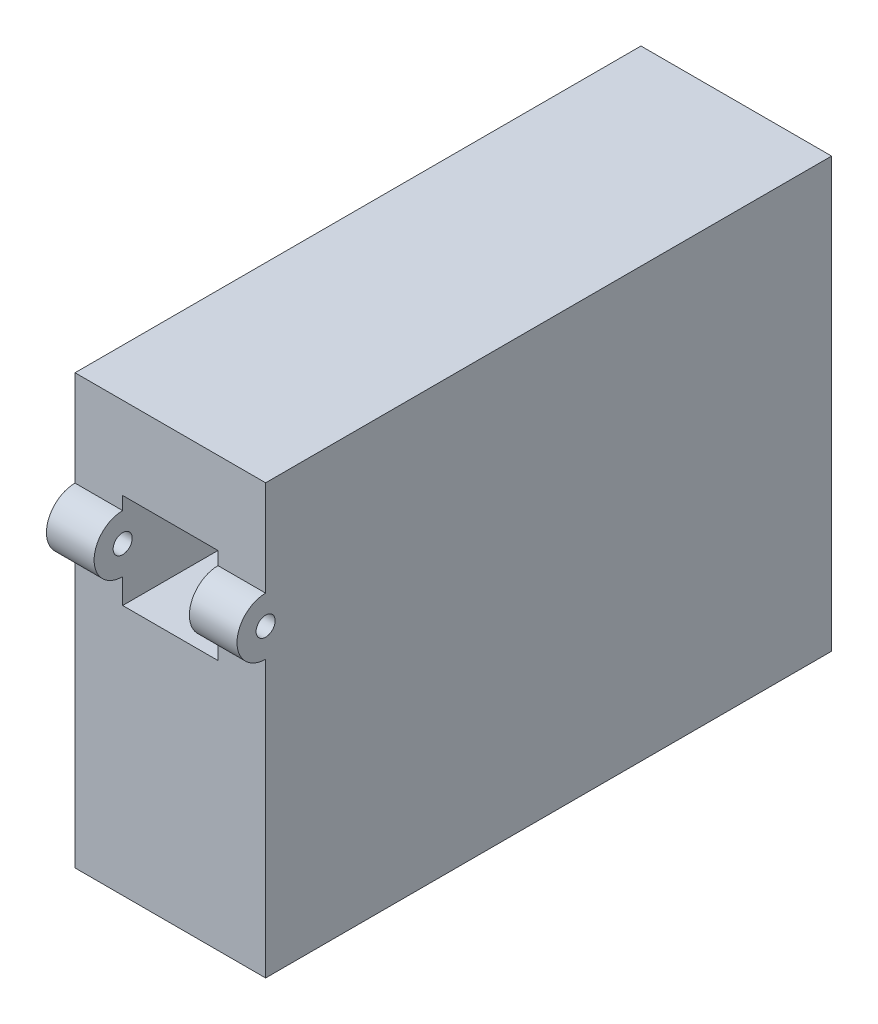
ISO-10303-21;
HEADER;
FILE_DESCRIPTION(('STEP AP214'),'2;1');
FILE_NAME('part.step','',(''),(''),'','','');
FILE_SCHEMA(('AUTOMOTIVE_DESIGN { 1 0 10303 214 1 1 1 1 }'));
ENDSEC;
DATA;
#1=APPLICATION_CONTEXT('core data for automotive mechanical design processes');
#2=APPLICATION_PROTOCOL_DEFINITION('international standard','automotive_design',2000,#1);
#3=PRODUCT_CONTEXT('',#1,'mechanical');
#4=PRODUCT('Part','Part','',(#3));
#5=PRODUCT_RELATED_PRODUCT_CATEGORY('part','',(#4));
#6=PRODUCT_DEFINITION_FORMATION('','',#4);
#7=PRODUCT_DEFINITION_CONTEXT('part definition',#1,'design');
#8=PRODUCT_DEFINITION('design','',#6,#7);
#9=PRODUCT_DEFINITION_SHAPE('','',#8);
#10=(LENGTH_UNIT() NAMED_UNIT(*) SI_UNIT(.MILLI.,.METRE.));
#11=(NAMED_UNIT(*) PLANE_ANGLE_UNIT() SI_UNIT($,.RADIAN.));
#12=(NAMED_UNIT(*) SI_UNIT($,.STERADIAN.) SOLID_ANGLE_UNIT());
#13=UNCERTAINTY_MEASURE_WITH_UNIT(LENGTH_MEASURE(1.E-05),#10,'distance_accuracy_value','');
#14=(GEOMETRIC_REPRESENTATION_CONTEXT(3) GLOBAL_UNCERTAINTY_ASSIGNED_CONTEXT((#13)) GLOBAL_UNIT_ASSIGNED_CONTEXT((#10,
#11,#12)) REPRESENTATION_CONTEXT('',''));
#15=CARTESIAN_POINT('',(0.,0.,0.));
#16=DIRECTION('',(0.,0.,1.));
#17=DIRECTION('',(1.,0.,0.));
#18=AXIS2_PLACEMENT_3D('',#15,#16,#17);
#19=CARTESIAN_POINT('',(-39.738281037695,36.9720169389535,5.37256734597199));
#20=DIRECTION('',(1.,0.,0.));
#21=DIRECTION('',(0.,0.,-1.));
#22=AXIS2_PLACEMENT_3D('',#19,#20,#21);
#23=CYLINDRICAL_SURFACE('',#22,1.);
#24=CARTESIAN_POINT('',(-54.7382810376951,36.9720169389535,5.37256734597198));
#25=DIRECTION('',(1.,0.,0.));
#26=DIRECTION('',(0.,0.,1.));
#27=AXIS2_PLACEMENT_3D('',#24,#25,#26);
#28=CIRCLE('',#27,1.);
#29=CARTESIAN_POINT('',(-54.7382810376951,36.9720169389535,6.37256734597198));
#30=VERTEX_POINT('',#29);
#31=EDGE_CURVE('E293',#30,#30,#28,.T.);
#32=ORIENTED_EDGE('',*,*,#31,.F.);
#33=EDGE_LOOP('',(#32));
#34=FACE_BOUND('',#33,.T.);
#35=CARTESIAN_POINT('',(-49.7382810376951,36.9720169389535,5.37256734597198));
#36=DIRECTION('',(1.,0.,0.));
#37=DIRECTION('',(0.,0.,1.));
#38=AXIS2_PLACEMENT_3D('',#35,#36,#37);
#39=CIRCLE('',#38,1.);
#40=CARTESIAN_POINT('',(-49.7382810376951,36.9720169389535,6.37256734597198));
#41=VERTEX_POINT('',#40);
#42=EDGE_CURVE('E296',#41,#41,#39,.T.);
#43=ORIENTED_EDGE('',*,*,#42,.T.);
#44=EDGE_LOOP('',(#43));
#45=FACE_BOUND('',#44,.T.);
#46=ADVANCED_FACE('F34',(#34,#45),#23,.F.);
#47=CARTESIAN_POINT('',(-39.7382810376951,36.9720169389535,5.37256734597198));
#48=DIRECTION('',(1.,0.,0.));
#49=DIRECTION('',(0.,0.,-1.));
#50=AXIS2_PLACEMENT_3D('',#47,#48,#49);
#51=CIRCLE('',#50,1.);
#52=CARTESIAN_POINT('',(-39.7382810376951,36.9720169389535,4.37256734597198));
#53=VERTEX_POINT('',#52);
#54=EDGE_CURVE('E306',#53,#53,#51,.T.);
#55=ORIENTED_EDGE('',*,*,#54,.F.);
#56=EDGE_LOOP('',(#55));
#57=FACE_BOUND('',#56,.T.);
#58=CARTESIAN_POINT('',(-34.7382810376951,36.9720169389535,5.37256734597198));
#59=DIRECTION('',(1.,0.,0.));
#60=DIRECTION('',(0.,0.,-1.));
#61=AXIS2_PLACEMENT_3D('',#58,#59,#60);
#62=CIRCLE('',#61,1.);
#63=CARTESIAN_POINT('',(-34.7382810376951,36.9720169389535,4.37256734597198));
#64=VERTEX_POINT('',#63);
#65=EDGE_CURVE('E308',#64,#64,#62,.T.);
#66=ORIENTED_EDGE('',*,*,#65,.T.);
#67=EDGE_LOOP('',(#66));
#68=FACE_BOUND('',#67,.T.);
#69=ADVANCED_FACE('F252',(#57,#68),#23,.F.);
#70=CARTESIAN_POINT('',(-34.7382810376951,-9.99999857891453E-05,5.37256734597198));
#71=DIRECTION('',(0.,0.,1.));
#72=DIRECTION('',(1.,0.,0.));
#73=AXIS2_PLACEMENT_3D('',#70,#71,#72);
#74=PLANE('',#73);
#75=DIRECTION('',(-1.,0.,0.));
#76=VECTOR('',#75,1.);
#77=CARTESIAN_POINT('',(-49.7382810376951,39.9720169389535,5.37256734597198));
#78=LINE('',#77,#76);
#79=CARTESIAN_POINT('',(-49.7382810376951,39.9720169389535,5.37256734597198));
#80=VERTEX_POINT('',#79);
#81=CARTESIAN_POINT('',(-54.7382810376951,39.9720169389535,5.37256734597198));
#82=VERTEX_POINT('',#81);
#83=EDGE_CURVE('E314',#80,#82,#78,.T.);
#84=ORIENTED_EDGE('',*,*,#83,.F.);
#85=DIRECTION('',(0.,-1.,0.));
#86=VECTOR('',#85,1.);
#87=CARTESIAN_POINT('',(-49.7382810376951,31.3488225347687,5.37256734597198));
#88=LINE('',#87,#86);
#89=CARTESIAN_POINT('',(-49.7382810376951,41.3488225347687,5.37256734597198));
#90=VERTEX_POINT('',#89);
#91=EDGE_CURVE('E281',#90,#80,#88,.T.);
#92=ORIENTED_EDGE('',*,*,#91,.F.);
#93=DIRECTION('',(-1.,0.,0.));
#94=VECTOR('',#93,1.);
#95=CARTESIAN_POINT('',(-49.7382810376951,41.3488225347687,5.37256734597198));
#96=LINE('',#95,#94);
#97=CARTESIAN_POINT('',(-39.7382810376951,41.3488225347687,5.37256734597198));
#98=VERTEX_POINT('',#97);
#99=EDGE_CURVE('E219',#98,#90,#96,.T.);
#100=ORIENTED_EDGE('',*,*,#99,.F.);
#101=DIRECTION('',(0.,1.,0.));
#102=VECTOR('',#101,1.);
#103=CARTESIAN_POINT('',(-39.7382810376951,41.3488225347687,5.37256734597198));
#104=LINE('',#103,#102);
#105=CARTESIAN_POINT('',(-39.7382810376951,39.9720169389535,5.37256734597199));
#106=VERTEX_POINT('',#105);
#107=EDGE_CURVE('E210',#106,#98,#104,.T.);
#108=ORIENTED_EDGE('',*,*,#107,.F.);
#109=DIRECTION('',(1.,0.,0.));
#110=VECTOR('',#109,1.);
#111=CARTESIAN_POINT('',(-39.7382810376951,39.9720169389535,5.37256734597199));
#112=LINE('',#111,#110);
#113=CARTESIAN_POINT('',(-34.7382810376951,39.9720169389535,5.37256734597199));
#114=VERTEX_POINT('',#113);
#115=EDGE_CURVE('E297',#106,#114,#112,.T.);
#116=ORIENTED_EDGE('',*,*,#115,.T.);
#117=DIRECTION('',(0.,1.,0.));
#118=VECTOR('',#117,1.);
#119=CARTESIAN_POINT('',(-34.7382810376951,-9.99999857891453E-05,5.37256734597198));
#120=LINE('',#119,#118);
#121=CARTESIAN_POINT('',(-34.7382810376951,50.0000000000142,5.37256734597198));
#122=VERTEX_POINT('',#121);
#123=EDGE_CURVE('E185',#114,#122,#120,.T.);
#124=ORIENTED_EDGE('',*,*,#123,.T.);
#125=DIRECTION('',(1.,0.,0.));
#126=VECTOR('',#125,1.);
#127=CARTESIAN_POINT('',(-34.7382810376951,50.0000000000142,5.37256734597198));
#128=LINE('',#127,#126);
#129=CARTESIAN_POINT('',(-54.7382810376951,50.0000000000142,5.37256734597198));
#130=VERTEX_POINT('',#129);
#131=EDGE_CURVE('E221',#130,#122,#128,.T.);
#132=ORIENTED_EDGE('',*,*,#131,.F.);
#133=DIRECTION('',(0.,1.,0.));
#134=VECTOR('',#133,1.);
#135=CARTESIAN_POINT('',(-54.7382810376951,-9.99999857891453E-05,5.37256734597198));
#136=LINE('',#135,#134);
#137=EDGE_CURVE('E187',#82,#130,#136,.T.);
#138=ORIENTED_EDGE('',*,*,#137,.F.);
#139=EDGE_LOOP('',(#84,#92,#100,#108,#116,#124,#132,#138));
#140=FACE_BOUND('',#139,.T.);
#141=ADVANCED_FACE('F234',(#140),#74,.T.);
#142=DIRECTION('',(-1.,0.,0.));
#143=VECTOR('',#142,1.);
#144=CARTESIAN_POINT('',(-54.7382810376951,4.99990000001421,5.37256734597199));
#145=LINE('',#144,#143);
#146=CARTESIAN_POINT('',(-34.7382810376951,4.99990000001421,5.37256734597198));
#147=VERTEX_POINT('',#146);
#148=CARTESIAN_POINT('',(-54.7382810376951,4.99990000001421,5.37256734597199));
#149=VERTEX_POINT('',#148);
#150=EDGE_CURVE('E164',#147,#149,#145,.T.);
#151=ORIENTED_EDGE('',*,*,#150,.F.);
#152=CARTESIAN_POINT('',(-34.7382810376951,33.9720169389535,5.37256734597199));
#153=VERTEX_POINT('',#152);
#154=EDGE_CURVE('E178',#147,#153,#120,.T.);
#155=ORIENTED_EDGE('',*,*,#154,.T.);
#156=DIRECTION('',(1.,0.,0.));
#157=VECTOR('',#156,1.);
#158=CARTESIAN_POINT('',(-39.7382810376951,33.9720169389535,5.37256734597199));
#159=LINE('',#158,#157);
#160=CARTESIAN_POINT('',(-39.7382810376951,33.9720169389535,5.37256734597199));
#161=VERTEX_POINT('',#160);
#162=EDGE_CURVE('E287',#161,#153,#159,.T.);
#163=ORIENTED_EDGE('',*,*,#162,.F.);
#164=CARTESIAN_POINT('',(-39.7382810376951,31.3488225347687,5.37256734597198));
#165=VERTEX_POINT('',#164);
#166=EDGE_CURVE('E284',#165,#161,#104,.T.);
#167=ORIENTED_EDGE('',*,*,#166,.F.);
#168=DIRECTION('',(1.,0.,0.));
#169=VECTOR('',#168,1.);
#170=CARTESIAN_POINT('',(-39.7382810376951,31.3488225347687,5.37256734597198));
#171=LINE('',#170,#169);
#172=CARTESIAN_POINT('',(-49.7382810376951,31.3488225347687,5.37256734597198));
#173=VERTEX_POINT('',#172);
#174=EDGE_CURVE('E277',#173,#165,#171,.T.);
#175=ORIENTED_EDGE('',*,*,#174,.F.);
#176=CARTESIAN_POINT('',(-49.7382810376951,33.9720169389535,5.37256734597199));
#177=VERTEX_POINT('',#176);
#178=EDGE_CURVE('E292',#177,#173,#88,.T.);
#179=ORIENTED_EDGE('',*,*,#178,.F.);
#180=DIRECTION('',(-1.,0.,0.));
#181=VECTOR('',#180,1.);
#182=CARTESIAN_POINT('',(-49.7382810376951,33.9720169389535,5.37256734597199));
#183=LINE('',#182,#181);
#184=CARTESIAN_POINT('',(-54.7382810376951,33.9720169389535,5.37256734597199));
#185=VERTEX_POINT('',#184);
#186=EDGE_CURVE('E311',#177,#185,#183,.T.);
#187=ORIENTED_EDGE('',*,*,#186,.T.);
#188=EDGE_CURVE('E186',#149,#185,#136,.T.);
#189=ORIENTED_EDGE('',*,*,#188,.F.);
#190=EDGE_LOOP('',(#151,#155,#163,#167,#175,#179,#187,#189));
#191=FACE_BOUND('',#190,.T.);
#192=ADVANCED_FACE('F285',(#191),#74,.T.);
#193=CARTESIAN_POINT('',(-54.7382810376951,-9.99999857891453E-05,-54.0103690100015));
#194=DIRECTION('',(-1.,0.,0.));
#195=DIRECTION('',(0.,0.,1.));
#196=AXIS2_PLACEMENT_3D('',#193,#194,#195);
#197=PLANE('',#196);
#198=DIRECTION('',(0.,1.,0.));
#199=VECTOR('',#198,1.);
#200=CARTESIAN_POINT('',(-54.7382810376951,-9.99999857891453E-05,-54.0103690100015));
#201=LINE('',#200,#199);
#202=CARTESIAN_POINT('',(-54.7382810376951,4.99990000001421,-54.0103690100015));
#203=VERTEX_POINT('',#202);
#204=CARTESIAN_POINT('',(-54.7382810376951,50.0000000000142,-54.0103690100015));
#205=VERTEX_POINT('',#204);
#206=EDGE_CURVE('E153',#203,#205,#201,.T.);
#207=ORIENTED_EDGE('',*,*,#206,.F.);
#208=DIRECTION('',(0.,0.,-1.));
#209=VECTOR('',#208,1.);
#210=CARTESIAN_POINT('',(-54.7382810376951,4.99990000001421,-34.4209299405518));
#211=LINE('',#210,#209);
#212=EDGE_CURVE('E161',#149,#203,#211,.T.);
#213=ORIENTED_EDGE('',*,*,#212,.F.);
#214=ORIENTED_EDGE('',*,*,#188,.T.);
#215=CARTESIAN_POINT('',(-54.7382810376951,36.9720169389535,5.37256734597198));
#216=DIRECTION('',(-1.,0.,0.));
#217=DIRECTION('',(0.,0.,1.));
#218=AXIS2_PLACEMENT_3D('',#215,#216,#217);
#219=CIRCLE('',#218,3.);
#220=EDGE_CURVE('E231',#185,#82,#219,.T.);
#221=ORIENTED_EDGE('',*,*,#220,.T.);
#222=ORIENTED_EDGE('',*,*,#137,.T.);
#223=DIRECTION('',(0.,0.,1.));
#224=VECTOR('',#223,1.);
#225=CARTESIAN_POINT('',(-54.7382810376951,50.0000000000142,-54.0103690100015));
#226=LINE('',#225,#224);
#227=EDGE_CURVE('E173',#205,#130,#226,.T.);
#228=ORIENTED_EDGE('',*,*,#227,.F.);
#229=EDGE_LOOP('',(#207,#213,#214,#221,#222,#228));
#230=FACE_BOUND('',#229,.T.);
#231=ORIENTED_EDGE('',*,*,#31,.T.);
#232=EDGE_LOOP('',(#231));
#233=FACE_BOUND('',#232,.T.);
#234=ADVANCED_FACE('F36',(#230,#233),#197,.T.);
#235=CARTESIAN_POINT('',(-54.7382810376951,-9.99999857891453E-05,-54.0103690100015));
#236=DIRECTION('',(0.,0.,-1.));
#237=DIRECTION('',(-1.,0.,0.));
#238=AXIS2_PLACEMENT_3D('',#235,#236,#237);
#239=PLANE('',#238);
#240=DIRECTION('',(1.,0.,0.));
#241=VECTOR('',#240,1.);
#242=CARTESIAN_POINT('',(-54.7382810376951,4.99990000001421,-54.0103690100015));
#243=LINE('',#242,#241);
#244=CARTESIAN_POINT('',(-34.7382810376951,4.99990000001421,-54.0103690100015));
#245=VERTEX_POINT('',#244);
#246=EDGE_CURVE('E147',#203,#245,#243,.T.);
#247=ORIENTED_EDGE('',*,*,#246,.F.);
#248=ORIENTED_EDGE('',*,*,#206,.T.);
#249=DIRECTION('',(-1.,0.,0.));
#250=VECTOR('',#249,1.);
#251=CARTESIAN_POINT('',(-54.7382810376951,50.0000000000142,-54.0103690100015));
#252=LINE('',#251,#250);
#253=CARTESIAN_POINT('',(-34.7382810376951,50.0000000000142,-54.0103690100015));
#254=VERTEX_POINT('',#253);
#255=EDGE_CURVE('E181',#254,#205,#252,.T.);
#256=ORIENTED_EDGE('',*,*,#255,.F.);
#257=DIRECTION('',(0.,1.,0.));
#258=VECTOR('',#257,1.);
#259=CARTESIAN_POINT('',(-34.7382810376951,-9.99999857891453E-05,-54.0103690100015));
#260=LINE('',#259,#258);
#261=EDGE_CURVE('E155',#245,#254,#260,.T.);
#262=ORIENTED_EDGE('',*,*,#261,.F.);
#263=EDGE_LOOP('',(#247,#248,#256,#262));
#264=FACE_BOUND('',#263,.T.);
#265=DIRECTION('',(1.,0.,0.));
#266=VECTOR('',#265,1.);
#267=CARTESIAN_POINT('',(-36.7382810376951,46.0000000000142,-54.0103690100015));
#268=LINE('',#267,#266);
#269=CARTESIAN_POINT('',(-52.7313957413908,46.0000000000142,-54.0103690100015));
#270=VERTEX_POINT('',#269);
#271=CARTESIAN_POINT('',(-36.7382810376951,46.0000000000142,-54.0103690100015));
#272=VERTEX_POINT('',#271);
#273=EDGE_CURVE('E57',#270,#272,#268,.T.);
#274=ORIENTED_EDGE('',*,*,#273,.F.);
#275=DIRECTION('',(0.,1.,0.));
#276=VECTOR('',#275,1.);
#277=CARTESIAN_POINT('',(-52.7313957413908,10.0159543390816,-54.0103690100015));
#278=LINE('',#277,#276);
#279=CARTESIAN_POINT('',(-52.7313957413908,10.0159543390816,-54.0103690100015));
#280=VERTEX_POINT('',#279);
#281=EDGE_CURVE('E330',#280,#270,#278,.T.);
#282=ORIENTED_EDGE('',*,*,#281,.F.);
#283=DIRECTION('',(-1.,0.,0.));
#284=VECTOR('',#283,1.);
#285=CARTESIAN_POINT('',(-36.7382810376951,10.0159543390816,-54.0103690100015));
#286=LINE('',#285,#284);
#287=CARTESIAN_POINT('',(-36.7382810376951,10.0159543390816,-54.0103690100015));
#288=VERTEX_POINT('',#287);
#289=EDGE_CURVE('E334',#288,#280,#286,.T.);
#290=ORIENTED_EDGE('',*,*,#289,.F.);
#291=DIRECTION('',(0.,-1.,0.));
#292=VECTOR('',#291,1.);
#293=CARTESIAN_POINT('',(-36.7382810376951,46.0000000000142,-54.0103690100015));
#294=LINE('',#293,#292);
#295=EDGE_CURVE('E337',#272,#288,#294,.T.);
#296=ORIENTED_EDGE('',*,*,#295,.F.);
#297=EDGE_LOOP('',(#274,#282,#290,#296));
#298=FACE_BOUND('',#297,.T.);
#299=ADVANCED_FACE('F149',(#264,#298),#239,.T.);
#300=CARTESIAN_POINT('',(-34.7382810376951,-9.99999857891453E-05,-54.0103690100015));
#301=DIRECTION('',(1.,0.,0.));
#302=DIRECTION('',(0.,0.,-1.));
#303=AXIS2_PLACEMENT_3D('',#300,#301,#302);
#304=PLANE('',#303);
#305=DIRECTION('',(0.,0.,1.));
#306=VECTOR('',#305,1.);
#307=CARTESIAN_POINT('',(-34.7382810376951,4.99990000001421,5.37256734597198));
#308=LINE('',#307,#306);
#309=EDGE_CURVE('E167',#245,#147,#308,.T.);
#310=ORIENTED_EDGE('',*,*,#309,.F.);
#311=ORIENTED_EDGE('',*,*,#261,.T.);
#312=DIRECTION('',(0.,0.,-1.));
#313=VECTOR('',#312,1.);
#314=CARTESIAN_POINT('',(-34.7382810376951,50.0000000000142,-54.0103690100015));
#315=LINE('',#314,#313);
#316=EDGE_CURVE('E223',#122,#254,#315,.T.);
#317=ORIENTED_EDGE('',*,*,#316,.F.);
#318=ORIENTED_EDGE('',*,*,#123,.F.);
#319=CARTESIAN_POINT('',(-34.7382810376951,36.9720169389535,5.37256734597199));
#320=DIRECTION('',(1.,0.,0.));
#321=DIRECTION('',(0.,0.,-1.));
#322=AXIS2_PLACEMENT_3D('',#319,#320,#321);
#323=CIRCLE('',#322,3.);
#324=EDGE_CURVE('E303',#114,#153,#323,.T.);
#325=ORIENTED_EDGE('',*,*,#324,.T.);
#326=ORIENTED_EDGE('',*,*,#154,.F.);
#327=EDGE_LOOP('',(#310,#311,#317,#318,#325,#326));
#328=FACE_BOUND('',#327,.T.);
#329=ORIENTED_EDGE('',*,*,#65,.F.);
#330=EDGE_LOOP('',(#329));
#331=FACE_BOUND('',#330,.T.);
#332=ADVANCED_FACE('F240',(#328,#331),#304,.T.);
#333=CARTESIAN_POINT('',(0.,50.0000000000142,0.));
#334=DIRECTION('',(0.,-1.,0.));
#335=DIRECTION('',(0.,0.,-1.));
#336=AXIS2_PLACEMENT_3D('',#333,#334,#335);
#337=PLANE('',#336);
#338=ORIENTED_EDGE('',*,*,#227,.T.);
#339=ORIENTED_EDGE('',*,*,#131,.T.);
#340=ORIENTED_EDGE('',*,*,#316,.T.);
#341=ORIENTED_EDGE('',*,*,#255,.T.);
#342=EDGE_LOOP('',(#338,#339,#340,#341));
#343=FACE_BOUND('',#342,.T.);
#344=ADVANCED_FACE('F237',(#343),#337,.F.);
#345=CARTESIAN_POINT('',(-49.7382810376951,31.3488225347687,5.29576681363769));
#346=DIRECTION('',(-1.,0.,0.));
#347=DIRECTION('',(0.,0.,1.));
#348=AXIS2_PLACEMENT_3D('',#345,#346,#347);
#349=PLANE('',#348);
#350=ORIENTED_EDGE('',*,*,#42,.F.);
#351=EDGE_LOOP('',(#350));
#352=FACE_BOUND('',#351,.T.);
#353=ORIENTED_EDGE('',*,*,#91,.T.);
#354=CARTESIAN_POINT('',(-49.7382810376951,36.9720169389535,5.37256734597198));
#355=DIRECTION('',(-1.,0.,0.));
#356=DIRECTION('',(0.,0.,1.));
#357=AXIS2_PLACEMENT_3D('',#354,#355,#356);
#358=CIRCLE('',#357,3.);
#359=EDGE_CURVE('E316',#177,#80,#358,.T.);
#360=ORIENTED_EDGE('',*,*,#359,.F.);
#361=ORIENTED_EDGE('',*,*,#178,.T.);
#362=DIRECTION('',(0.,0.,1.));
#363=VECTOR('',#362,1.);
#364=CARTESIAN_POINT('',(-49.7382810376951,31.3488225347687,5.29576681363769));
#365=LINE('',#364,#363);
#366=CARTESIAN_POINT('',(-49.7382810376951,31.3488225347687,-18.0103690100015));
#367=VERTEX_POINT('',#366);
#368=EDGE_CURVE('E213',#367,#173,#365,.T.);
#369=ORIENTED_EDGE('',*,*,#368,.F.);
#370=DIRECTION('',(0.,1.,0.));
#371=VECTOR('',#370,1.);
#372=CARTESIAN_POINT('',(-49.7382810376951,0.,-18.0103690100015));
#373=LINE('',#372,#371);
#374=CARTESIAN_POINT('',(-49.7382810376951,41.3488225347687,-18.0103690100015));
#375=VERTEX_POINT('',#374);
#376=EDGE_CURVE('E11',#367,#375,#373,.T.);
#377=ORIENTED_EDGE('',*,*,#376,.T.);
#378=DIRECTION('',(0.,0.,1.));
#379=VECTOR('',#378,1.);
#380=CARTESIAN_POINT('',(-49.7382810376951,41.3488225347687,5.29576681363769));
#381=LINE('',#380,#379);
#382=EDGE_CURVE('E198',#375,#90,#381,.T.);
#383=ORIENTED_EDGE('',*,*,#382,.T.);
#384=EDGE_LOOP('',(#353,#360,#361,#369,#377,#383));
#385=FACE_BOUND('',#384,.T.);
#386=ADVANCED_FACE('F239',(#352,#385),#349,.F.);
#387=CARTESIAN_POINT('',(-49.7382810376951,41.3488225347687,5.29576681363769));
#388=DIRECTION('',(0.,1.,0.));
#389=DIRECTION('',(0.,0.,1.));
#390=AXIS2_PLACEMENT_3D('',#387,#388,#389);
#391=PLANE('',#390);
#392=ORIENTED_EDGE('',*,*,#99,.T.);
#393=ORIENTED_EDGE('',*,*,#382,.F.);
#394=DIRECTION('',(1.,0.,0.));
#395=VECTOR('',#394,1.);
#396=CARTESIAN_POINT('',(0.,41.3488225347687,-18.0103690100015));
#397=LINE('',#396,#395);
#398=CARTESIAN_POINT('',(-39.7382810376951,41.3488225347687,-18.0103690100015));
#399=VERTEX_POINT('',#398);
#400=EDGE_CURVE('E42',#375,#399,#397,.T.);
#401=ORIENTED_EDGE('',*,*,#400,.T.);
#402=DIRECTION('',(0.,0.,1.));
#403=VECTOR('',#402,1.);
#404=CARTESIAN_POINT('',(-39.7382810376951,41.3488225347687,5.29576681363769));
#405=LINE('',#404,#403);
#406=EDGE_CURVE('E196',#399,#98,#405,.T.);
#407=ORIENTED_EDGE('',*,*,#406,.T.);
#408=EDGE_LOOP('',(#392,#393,#401,#407));
#409=FACE_BOUND('',#408,.T.);
#410=ADVANCED_FACE('F195',(#409),#391,.F.);
#411=CARTESIAN_POINT('',(-39.7382810376951,41.3488225347687,5.29576681363769));
#412=DIRECTION('',(1.,0.,0.));
#413=DIRECTION('',(0.,0.,-1.));
#414=AXIS2_PLACEMENT_3D('',#411,#412,#413);
#415=PLANE('',#414);
#416=ORIENTED_EDGE('',*,*,#406,.F.);
#417=DIRECTION('',(0.,-1.,0.));
#418=VECTOR('',#417,1.);
#419=CARTESIAN_POINT('',(-39.7382810376951,0.,-18.0103690100015));
#420=LINE('',#419,#418);
#421=CARTESIAN_POINT('',(-39.7382810376951,31.3488225347687,-18.0103690100015));
#422=VERTEX_POINT('',#421);
#423=EDGE_CURVE('E176',#399,#422,#420,.T.);
#424=ORIENTED_EDGE('',*,*,#423,.T.);
#425=DIRECTION('',(0.,0.,1.));
#426=VECTOR('',#425,1.);
#427=CARTESIAN_POINT('',(-39.7382810376951,31.3488225347687,5.29576681363769));
#428=LINE('',#427,#426);
#429=EDGE_CURVE('E49',#422,#165,#428,.T.);
#430=ORIENTED_EDGE('',*,*,#429,.T.);
#431=ORIENTED_EDGE('',*,*,#166,.T.);
#432=CARTESIAN_POINT('',(-39.7382810376951,36.9720169389535,5.37256734597199));
#433=DIRECTION('',(1.,0.,0.));
#434=DIRECTION('',(0.,0.,-1.));
#435=AXIS2_PLACEMENT_3D('',#432,#433,#434);
#436=CIRCLE('',#435,3.);
#437=EDGE_CURVE('E301',#106,#161,#436,.T.);
#438=ORIENTED_EDGE('',*,*,#437,.F.);
#439=ORIENTED_EDGE('',*,*,#107,.T.);
#440=EDGE_LOOP('',(#416,#424,#430,#431,#438,#439));
#441=FACE_BOUND('',#440,.T.);
#442=ORIENTED_EDGE('',*,*,#54,.T.);
#443=EDGE_LOOP('',(#442));
#444=FACE_BOUND('',#443,.T.);
#445=ADVANCED_FACE('F205',(#441,#444),#415,.F.);
#446=CARTESIAN_POINT('',(-39.7382810376951,31.3488225347687,5.29576681363769));
#447=DIRECTION('',(0.,-1.,0.));
#448=DIRECTION('',(0.,0.,-1.));
#449=AXIS2_PLACEMENT_3D('',#446,#447,#448);
#450=PLANE('',#449);
#451=ORIENTED_EDGE('',*,*,#174,.T.);
#452=ORIENTED_EDGE('',*,*,#429,.F.);
#453=DIRECTION('',(-1.,0.,0.));
#454=VECTOR('',#453,1.);
#455=CARTESIAN_POINT('',(0.,31.3488225347687,-18.0103690100015));
#456=LINE('',#455,#454);
#457=EDGE_CURVE('E174',#422,#367,#456,.T.);
#458=ORIENTED_EDGE('',*,*,#457,.T.);
#459=ORIENTED_EDGE('',*,*,#368,.T.);
#460=EDGE_LOOP('',(#451,#452,#458,#459));
#461=FACE_BOUND('',#460,.T.);
#462=ADVANCED_FACE('F269',(#461),#450,.F.);
#463=CARTESIAN_POINT('',(-39.7382810376951,36.9720169389535,5.37256734597199));
#464=DIRECTION('',(1.,0.,0.));
#465=DIRECTION('',(0.,0.,-1.));
#466=AXIS2_PLACEMENT_3D('',#463,#464,#465);
#467=CYLINDRICAL_SURFACE('',#466,3.);
#468=ORIENTED_EDGE('',*,*,#324,.F.);
#469=ORIENTED_EDGE('',*,*,#115,.F.);
#470=ORIENTED_EDGE('',*,*,#437,.T.);
#471=ORIENTED_EDGE('',*,*,#162,.T.);
#472=EDGE_LOOP('',(#468,#469,#470,#471));
#473=FACE_BOUND('',#472,.T.);
#474=ADVANCED_FACE('F263',(#473),#467,.T.);
#475=CARTESIAN_POINT('',(-49.7382810376951,36.9720169389535,5.37256734597198));
#476=DIRECTION('',(-1.,0.,0.));
#477=DIRECTION('',(0.,0.,1.));
#478=AXIS2_PLACEMENT_3D('',#475,#476,#477);
#479=CYLINDRICAL_SURFACE('',#478,3.);
#480=ORIENTED_EDGE('',*,*,#220,.F.);
#481=ORIENTED_EDGE('',*,*,#186,.F.);
#482=ORIENTED_EDGE('',*,*,#359,.T.);
#483=ORIENTED_EDGE('',*,*,#83,.T.);
#484=EDGE_LOOP('',(#480,#481,#482,#483));
#485=FACE_BOUND('',#484,.T.);
#486=ADVANCED_FACE('F274',(#485),#479,.T.);
#487=CARTESIAN_POINT('',(-36.7382810376951,46.0000000000142,-18.0103690100015));
#488=DIRECTION('',(0.,1.,0.));
#489=DIRECTION('',(0.,0.,1.));
#490=AXIS2_PLACEMENT_3D('',#487,#488,#489);
#491=PLANE('',#490);
#492=ORIENTED_EDGE('',*,*,#273,.T.);
#493=DIRECTION('',(0.,0.,-1.));
#494=VECTOR('',#493,1.);
#495=CARTESIAN_POINT('',(-36.7382810376951,46.0000000000142,-18.0103690100015));
#496=LINE('',#495,#494);
#497=CARTESIAN_POINT('',(-36.7382810376951,46.0000000000142,-18.0103690100015));
#498=VERTEX_POINT('',#497);
#499=EDGE_CURVE('E322',#498,#272,#496,.T.);
#500=ORIENTED_EDGE('',*,*,#499,.F.);
#501=DIRECTION('',(1.,0.,0.));
#502=VECTOR('',#501,1.);
#503=CARTESIAN_POINT('',(-36.7382810376951,46.0000000000142,-18.0103690100015));
#504=LINE('',#503,#502);
#505=CARTESIAN_POINT('',(-52.7313957413908,46.0000000000142,-18.0103690100015));
#506=VERTEX_POINT('',#505);
#507=EDGE_CURVE('E333',#506,#498,#504,.T.);
#508=ORIENTED_EDGE('',*,*,#507,.F.);
#509=DIRECTION('',(0.,0.,-1.));
#510=VECTOR('',#509,1.);
#511=CARTESIAN_POINT('',(-52.7313957413908,46.0000000000142,-18.0103690100015));
#512=LINE('',#511,#510);
#513=EDGE_CURVE('E320',#506,#270,#512,.T.);
#514=ORIENTED_EDGE('',*,*,#513,.T.);
#515=EDGE_LOOP('',(#492,#500,#508,#514));
#516=FACE_BOUND('',#515,.T.);
#517=ADVANCED_FACE('F379',(#516),#491,.F.);
#518=CARTESIAN_POINT('',(-52.7313957413908,10.0159543390816,-18.0103690100015));
#519=DIRECTION('',(-1.,0.,0.));
#520=DIRECTION('',(0.,0.,1.));
#521=AXIS2_PLACEMENT_3D('',#518,#519,#520);
#522=PLANE('',#521);
#523=ORIENTED_EDGE('',*,*,#281,.T.);
#524=ORIENTED_EDGE('',*,*,#513,.F.);
#525=DIRECTION('',(0.,1.,0.));
#526=VECTOR('',#525,1.);
#527=CARTESIAN_POINT('',(-52.7313957413908,10.0159543390816,-18.0103690100015));
#528=LINE('',#527,#526);
#529=CARTESIAN_POINT('',(-52.7313957413908,10.0159543390816,-18.0103690100015));
#530=VERTEX_POINT('',#529);
#531=EDGE_CURVE('E325',#530,#506,#528,.T.);
#532=ORIENTED_EDGE('',*,*,#531,.F.);
#533=DIRECTION('',(0.,0.,-1.));
#534=VECTOR('',#533,1.);
#535=CARTESIAN_POINT('',(-52.7313957413908,10.0159543390816,-18.0103690100015));
#536=LINE('',#535,#534);
#537=EDGE_CURVE('E327',#530,#280,#536,.T.);
#538=ORIENTED_EDGE('',*,*,#537,.T.);
#539=EDGE_LOOP('',(#523,#524,#532,#538));
#540=FACE_BOUND('',#539,.T.);
#541=ADVANCED_FACE('F375',(#540),#522,.F.);
#542=CARTESIAN_POINT('',(-36.7382810376951,10.0159543390816,-18.0103690100015));
#543=DIRECTION('',(0.,-1.,0.));
#544=DIRECTION('',(0.,0.,-1.));
#545=AXIS2_PLACEMENT_3D('',#542,#543,#544);
#546=PLANE('',#545);
#547=ORIENTED_EDGE('',*,*,#289,.T.);
#548=ORIENTED_EDGE('',*,*,#537,.F.);
#549=DIRECTION('',(-1.,0.,0.));
#550=VECTOR('',#549,1.);
#551=CARTESIAN_POINT('',(-36.7382810376951,10.0159543390816,-18.0103690100015));
#552=LINE('',#551,#550);
#553=CARTESIAN_POINT('',(-36.7382810376951,10.0159543390816,-18.0103690100015));
#554=VERTEX_POINT('',#553);
#555=EDGE_CURVE('E343',#554,#530,#552,.T.);
#556=ORIENTED_EDGE('',*,*,#555,.F.);
#557=DIRECTION('',(0.,0.,-1.));
#558=VECTOR('',#557,1.);
#559=CARTESIAN_POINT('',(-36.7382810376951,10.0159543390816,-18.0103690100015));
#560=LINE('',#559,#558);
#561=EDGE_CURVE('E324',#554,#288,#560,.T.);
#562=ORIENTED_EDGE('',*,*,#561,.T.);
#563=EDGE_LOOP('',(#547,#548,#556,#562));
#564=FACE_BOUND('',#563,.T.);
#565=ADVANCED_FACE('F378',(#564),#546,.F.);
#566=CARTESIAN_POINT('',(-36.7382810376951,46.0000000000142,-18.0103690100015));
#567=DIRECTION('',(1.,0.,0.));
#568=DIRECTION('',(0.,0.,-1.));
#569=AXIS2_PLACEMENT_3D('',#566,#567,#568);
#570=PLANE('',#569);
#571=ORIENTED_EDGE('',*,*,#295,.T.);
#572=ORIENTED_EDGE('',*,*,#561,.F.);
#573=DIRECTION('',(0.,-1.,0.));
#574=VECTOR('',#573,1.);
#575=CARTESIAN_POINT('',(-36.7382810376951,46.0000000000142,-18.0103690100015));
#576=LINE('',#575,#574);
#577=EDGE_CURVE('E346',#498,#554,#576,.T.);
#578=ORIENTED_EDGE('',*,*,#577,.F.);
#579=ORIENTED_EDGE('',*,*,#499,.T.);
#580=EDGE_LOOP('',(#571,#572,#578,#579));
#581=FACE_BOUND('',#580,.T.);
#582=ADVANCED_FACE('F371',(#581),#570,.F.);
#583=CARTESIAN_POINT('',(0.,0.,-18.0103690100015));
#584=DIRECTION('',(0.,0.,-1.));
#585=DIRECTION('',(-1.,0.,0.));
#586=AXIS2_PLACEMENT_3D('',#583,#584,#585);
#587=PLANE('',#586);
#588=ORIENTED_EDGE('',*,*,#376,.F.);
#589=ORIENTED_EDGE('',*,*,#457,.F.);
#590=ORIENTED_EDGE('',*,*,#423,.F.);
#591=ORIENTED_EDGE('',*,*,#400,.F.);
#592=EDGE_LOOP('',(#588,#589,#590,#591));
#593=FACE_BOUND('',#592,.T.);
#594=ORIENTED_EDGE('',*,*,#507,.T.);
#595=ORIENTED_EDGE('',*,*,#577,.T.);
#596=ORIENTED_EDGE('',*,*,#555,.T.);
#597=ORIENTED_EDGE('',*,*,#531,.T.);
#598=EDGE_LOOP('',(#594,#595,#596,#597));
#599=FACE_BOUND('',#598,.T.);
#600=ADVANCED_FACE('F202',(#593,#599),#587,.T.);
#601=CARTESIAN_POINT('',(0.,4.99990000001421,0.));
#602=DIRECTION('',(0.,1.,0.));
#603=DIRECTION('',(0.,0.,1.));
#604=AXIS2_PLACEMENT_3D('',#601,#602,#603);
#605=PLANE('',#604);
#606=CARTESIAN_POINT('',(-44.7382810376951,4.99990000001421,-14.5241812972899));
#607=DIRECTION('',(0.,-1.,0.));
#608=DIRECTION('',(0.,0.,-1.));
#609=AXIS2_PLACEMENT_3D('',#606,#607,#608);
#610=CIRCLE('',#609,3.);
#611=CARTESIAN_POINT('',(-44.7382810376951,4.99990000001421,-17.5241812972899));
#612=VERTEX_POINT('',#611);
#613=EDGE_CURVE('E158',#612,#612,#610,.T.);
#614=ORIENTED_EDGE('',*,*,#613,.F.);
#615=EDGE_LOOP('',(#614));
#616=FACE_BOUND('',#615,.T.);
#617=ORIENTED_EDGE('',*,*,#212,.T.);
#618=ORIENTED_EDGE('',*,*,#246,.T.);
#619=ORIENTED_EDGE('',*,*,#309,.T.);
#620=ORIENTED_EDGE('',*,*,#150,.T.);
#621=EDGE_LOOP('',(#617,#618,#619,#620));
#622=FACE_BOUND('',#621,.T.);
#623=ADVANCED_FACE('F162',(#616,#622),#605,.F.);
#624=CARTESIAN_POINT('',(-44.7382810376951,7.99990000001421,-14.5241812972899));
#625=DIRECTION('',(0.,-1.,0.));
#626=DIRECTION('',(0.,0.,-1.));
#627=AXIS2_PLACEMENT_3D('',#624,#625,#626);
#628=CYLINDRICAL_SURFACE('',#627,3.);
#629=CARTESIAN_POINT('',(-44.7382810376951,7.99990000001421,-14.5241812972899));
#630=DIRECTION('',(0.,-1.,0.));
#631=DIRECTION('',(0.,0.,-1.));
#632=AXIS2_PLACEMENT_3D('',#629,#630,#631);
#633=CIRCLE('',#632,3.);
#634=CARTESIAN_POINT('',(-44.7382810376951,7.99990000001421,-17.5241812972899));
#635=VERTEX_POINT('',#634);
#636=EDGE_CURVE('E168',#635,#635,#633,.T.);
#637=ORIENTED_EDGE('',*,*,#636,.F.);
#638=EDGE_LOOP('',(#637));
#639=FACE_BOUND('',#638,.T.);
#640=ORIENTED_EDGE('',*,*,#613,.T.);
#641=EDGE_LOOP('',(#640));
#642=FACE_BOUND('',#641,.T.);
#643=ADVANCED_FACE('F360',(#639,#642),#628,.F.);
#644=CARTESIAN_POINT('',(-44.7382810376951,7.99990000001421,-14.5241812972899));
#645=DIRECTION('',(0.,-1.,0.));
#646=DIRECTION('',(0.,0.,-1.));
#647=AXIS2_PLACEMENT_3D('',#644,#645,#646);
#648=PLANE('',#647);
#649=ORIENTED_EDGE('',*,*,#636,.T.);
#650=EDGE_LOOP('',(#649));
#651=FACE_BOUND('',#650,.T.);
#652=ADVANCED_FACE('F358',(#651),#648,.T.);
#653=CLOSED_SHELL('',(#46,#69,#141,#192,#234,#299,#332,#344,#386,#410,#445,#462,#474,#486,#517,
#541,#565,#582,#600,#623,#643,#652));
#654=MANIFOLD_SOLID_BREP('B2',#653);
#655=ADVANCED_BREP_SHAPE_REPRESENTATION('',(#18,#654),#14);
#656=SHAPE_DEFINITION_REPRESENTATION(#9,#655);
ENDSEC;
END-ISO-10303-21;
